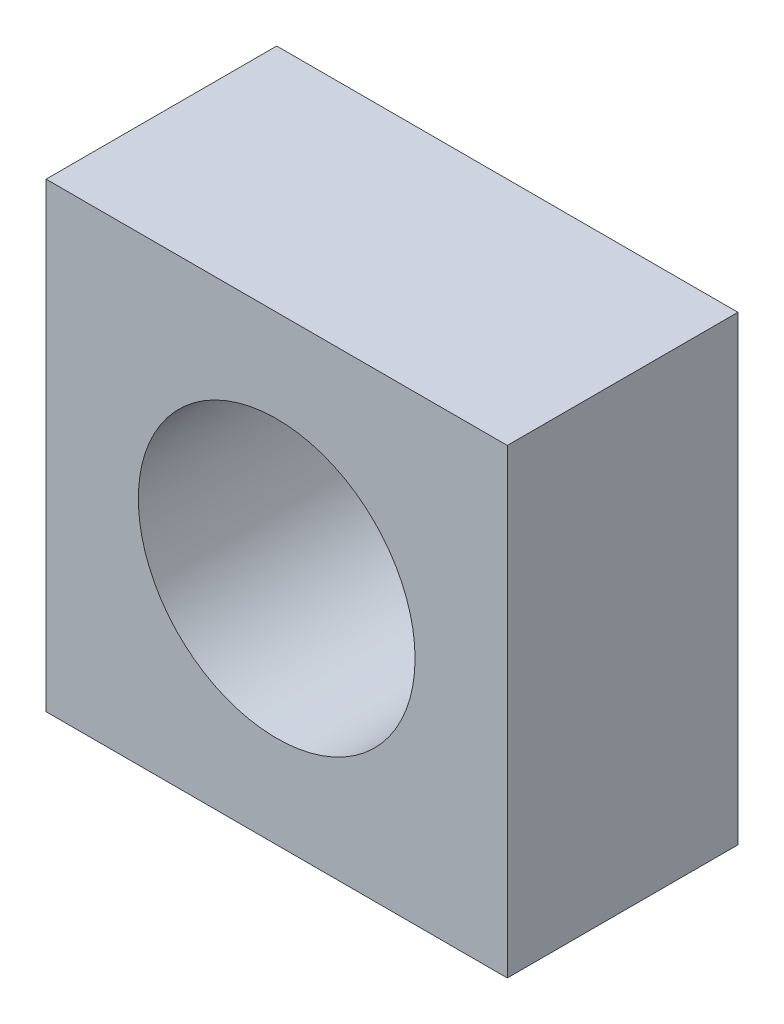
ISO-10303-21;
HEADER;
FILE_DESCRIPTION(('STEP AP214'),'2;1');
FILE_NAME('part.step','',(''),(''),'','','');
FILE_SCHEMA(('AUTOMOTIVE_DESIGN { 1 0 10303 214 1 1 1 1 }'));
ENDSEC;
DATA;
#1=APPLICATION_CONTEXT('core data for automotive mechanical design processes');
#2=APPLICATION_PROTOCOL_DEFINITION('international standard','automotive_design',2000,#1);
#3=PRODUCT_CONTEXT('',#1,'mechanical');
#4=PRODUCT('Part','Part','',(#3));
#5=PRODUCT_RELATED_PRODUCT_CATEGORY('part','',(#4));
#6=PRODUCT_DEFINITION_FORMATION('','',#4);
#7=PRODUCT_DEFINITION_CONTEXT('part definition',#1,'design');
#8=PRODUCT_DEFINITION('design','',#6,#7);
#9=PRODUCT_DEFINITION_SHAPE('','',#8);
#10=(LENGTH_UNIT() NAMED_UNIT(*) SI_UNIT(.MILLI.,.METRE.));
#11=(NAMED_UNIT(*) PLANE_ANGLE_UNIT() SI_UNIT($,.RADIAN.));
#12=(NAMED_UNIT(*) SI_UNIT($,.STERADIAN.) SOLID_ANGLE_UNIT());
#13=UNCERTAINTY_MEASURE_WITH_UNIT(LENGTH_MEASURE(1.E-05),#10,'distance_accuracy_value','');
#14=(GEOMETRIC_REPRESENTATION_CONTEXT(3) GLOBAL_UNCERTAINTY_ASSIGNED_CONTEXT((#13)) GLOBAL_UNIT_ASSIGNED_CONTEXT((#10,
#11,#12)) REPRESENTATION_CONTEXT('',''));
#15=CARTESIAN_POINT('',(0.,0.,0.));
#16=DIRECTION('',(0.,0.,1.));
#17=DIRECTION('',(1.,0.,0.));
#18=AXIS2_PLACEMENT_3D('',#15,#16,#17);
#19=CARTESIAN_POINT('',(0.,0.,2.5));
#20=DIRECTION('',(0.,0.,1.));
#21=DIRECTION('',(1.,0.,0.));
#22=AXIS2_PLACEMENT_3D('',#19,#20,#21);
#23=PLANE('',#22);
#24=DIRECTION('',(0.,-1.,0.));
#25=VECTOR('',#24,1.);
#26=CARTESIAN_POINT('',(-2.5,-2.5,2.5));
#27=LINE('',#26,#25);
#28=CARTESIAN_POINT('',(-2.5,2.5,2.5));
#29=VERTEX_POINT('',#28);
#30=CARTESIAN_POINT('',(-2.5,-2.5,2.5));
#31=VERTEX_POINT('',#30);
#32=EDGE_CURVE('E98',#29,#31,#27,.T.);
#33=ORIENTED_EDGE('',*,*,#32,.T.);
#34=DIRECTION('',(1.,0.,0.));
#35=VECTOR('',#34,1.);
#36=CARTESIAN_POINT('',(2.5,-2.5,2.5));
#37=LINE('',#36,#35);
#38=CARTESIAN_POINT('',(2.5,-2.5,2.5));
#39=VERTEX_POINT('',#38);
#40=EDGE_CURVE('E93',#31,#39,#37,.T.);
#41=ORIENTED_EDGE('',*,*,#40,.T.);
#42=DIRECTION('',(0.,1.,0.));
#43=VECTOR('',#42,1.);
#44=CARTESIAN_POINT('',(2.5,-2.5,2.5));
#45=LINE('',#44,#43);
#46=CARTESIAN_POINT('',(2.5,2.5,2.5));
#47=VERTEX_POINT('',#46);
#48=EDGE_CURVE('E96',#39,#47,#45,.T.);
#49=ORIENTED_EDGE('',*,*,#48,.T.);
#50=DIRECTION('',(-1.,0.,0.));
#51=VECTOR('',#50,1.);
#52=CARTESIAN_POINT('',(2.5,2.5,2.5));
#53=LINE('',#52,#51);
#54=EDGE_CURVE('E63',#47,#29,#53,.T.);
#55=ORIENTED_EDGE('',*,*,#54,.T.);
#56=EDGE_LOOP('',(#33,#41,#49,#55));
#57=FACE_BOUND('',#56,.T.);
#58=CARTESIAN_POINT('',(0.,0.,2.5));
#59=DIRECTION('',(0.,0.,1.));
#60=DIRECTION('',(1.,0.,0.));
#61=AXIS2_PLACEMENT_3D('',#58,#59,#60);
#62=CIRCLE('',#61,1.5);
#63=CARTESIAN_POINT('',(1.5,0.,2.5));
#64=VERTEX_POINT('',#63);
#65=EDGE_CURVE('E118',#64,#64,#62,.T.);
#66=ORIENTED_EDGE('',*,*,#65,.F.);
#67=EDGE_LOOP('',(#66));
#68=FACE_BOUND('',#67,.T.);
#69=ADVANCED_FACE('F45',(#57,#68),#23,.T.);
#70=CARTESIAN_POINT('',(0.,0.,0.));
#71=DIRECTION('',(0.,0.,1.));
#72=DIRECTION('',(1.,0.,0.));
#73=AXIS2_PLACEMENT_3D('',#70,#71,#72);
#74=PLANE('',#73);
#75=DIRECTION('',(0.,-1.,0.));
#76=VECTOR('',#75,1.);
#77=CARTESIAN_POINT('',(-2.5,-2.5,0.));
#78=LINE('',#77,#76);
#79=CARTESIAN_POINT('',(-2.5,2.5,0.));
#80=VERTEX_POINT('',#79);
#81=CARTESIAN_POINT('',(-2.5,-2.5,0.));
#82=VERTEX_POINT('',#81);
#83=EDGE_CURVE('E114',#80,#82,#78,.T.);
#84=ORIENTED_EDGE('',*,*,#83,.F.);
#85=DIRECTION('',(-1.,0.,0.));
#86=VECTOR('',#85,1.);
#87=CARTESIAN_POINT('',(2.5,2.5,0.));
#88=LINE('',#87,#86);
#89=CARTESIAN_POINT('',(2.5,2.5,0.));
#90=VERTEX_POINT('',#89);
#91=EDGE_CURVE('E86',#90,#80,#88,.T.);
#92=ORIENTED_EDGE('',*,*,#91,.F.);
#93=DIRECTION('',(0.,1.,0.));
#94=VECTOR('',#93,1.);
#95=CARTESIAN_POINT('',(2.5,-2.5,0.));
#96=LINE('',#95,#94);
#97=CARTESIAN_POINT('',(2.5,-2.5,0.));
#98=VERTEX_POINT('',#97);
#99=EDGE_CURVE('E80',#98,#90,#96,.T.);
#100=ORIENTED_EDGE('',*,*,#99,.F.);
#101=DIRECTION('',(1.,0.,0.));
#102=VECTOR('',#101,1.);
#103=CARTESIAN_POINT('',(2.5,-2.5,0.));
#104=LINE('',#103,#102);
#105=EDGE_CURVE('E103',#82,#98,#104,.T.);
#106=ORIENTED_EDGE('',*,*,#105,.F.);
#107=EDGE_LOOP('',(#84,#92,#100,#106));
#108=FACE_BOUND('',#107,.T.);
#109=CARTESIAN_POINT('',(0.,0.,0.));
#110=DIRECTION('',(0.,0.,1.));
#111=DIRECTION('',(1.,0.,0.));
#112=AXIS2_PLACEMENT_3D('',#109,#110,#111);
#113=CIRCLE('',#112,1.5);
#114=CARTESIAN_POINT('',(1.5,0.,0.));
#115=VERTEX_POINT('',#114);
#116=EDGE_CURVE('E136',#115,#115,#113,.T.);
#117=ORIENTED_EDGE('',*,*,#116,.T.);
#118=EDGE_LOOP('',(#117));
#119=FACE_BOUND('',#118,.T.);
#120=ADVANCED_FACE('F131',(#108,#119),#74,.F.);
#121=CARTESIAN_POINT('',(-2.5,-2.5,2.5));
#122=DIRECTION('',(1.,0.,0.));
#123=DIRECTION('',(0.,0.,-1.));
#124=AXIS2_PLACEMENT_3D('',#121,#122,#123);
#125=PLANE('',#124);
#126=ORIENTED_EDGE('',*,*,#83,.T.);
#127=DIRECTION('',(0.,0.,-1.));
#128=VECTOR('',#127,1.);
#129=CARTESIAN_POINT('',(-2.5,-2.5,2.5));
#130=LINE('',#129,#128);
#131=EDGE_CURVE('E11',#31,#82,#130,.T.);
#132=ORIENTED_EDGE('',*,*,#131,.F.);
#133=ORIENTED_EDGE('',*,*,#32,.F.);
#134=DIRECTION('',(0.,0.,-1.));
#135=VECTOR('',#134,1.);
#136=CARTESIAN_POINT('',(-2.5,2.5,2.5));
#137=LINE('',#136,#135);
#138=EDGE_CURVE('E110',#29,#80,#137,.T.);
#139=ORIENTED_EDGE('',*,*,#138,.T.);
#140=EDGE_LOOP('',(#126,#132,#133,#139));
#141=FACE_BOUND('',#140,.T.);
#142=ADVANCED_FACE('F47',(#141),#125,.F.);
#143=CARTESIAN_POINT('',(2.5,-2.5,2.5));
#144=DIRECTION('',(0.,1.,0.));
#145=DIRECTION('',(-1.,0.,0.));
#146=AXIS2_PLACEMENT_3D('',#143,#144,#145);
#147=PLANE('',#146);
#148=ORIENTED_EDGE('',*,*,#105,.T.);
#149=DIRECTION('',(0.,0.,-1.));
#150=VECTOR('',#149,1.);
#151=CARTESIAN_POINT('',(2.5,-2.5,2.5));
#152=LINE('',#151,#150);
#153=EDGE_CURVE('E55',#39,#98,#152,.T.);
#154=ORIENTED_EDGE('',*,*,#153,.F.);
#155=ORIENTED_EDGE('',*,*,#40,.F.);
#156=ORIENTED_EDGE('',*,*,#131,.T.);
#157=EDGE_LOOP('',(#148,#154,#155,#156));
#158=FACE_BOUND('',#157,.T.);
#159=ADVANCED_FACE('F102',(#158),#147,.F.);
#160=CARTESIAN_POINT('',(2.5,-2.5,2.5));
#161=DIRECTION('',(-1.,0.,0.));
#162=DIRECTION('',(0.,0.,1.));
#163=AXIS2_PLACEMENT_3D('',#160,#161,#162);
#164=PLANE('',#163);
#165=ORIENTED_EDGE('',*,*,#99,.T.);
#166=DIRECTION('',(0.,0.,-1.));
#167=VECTOR('',#166,1.);
#168=CARTESIAN_POINT('',(2.5,2.5,2.5));
#169=LINE('',#168,#167);
#170=EDGE_CURVE('E105',#47,#90,#169,.T.);
#171=ORIENTED_EDGE('',*,*,#170,.F.);
#172=ORIENTED_EDGE('',*,*,#48,.F.);
#173=ORIENTED_EDGE('',*,*,#153,.T.);
#174=EDGE_LOOP('',(#165,#171,#172,#173));
#175=FACE_BOUND('',#174,.T.);
#176=ADVANCED_FACE('F106',(#175),#164,.F.);
#177=CARTESIAN_POINT('',(2.5,2.5,2.5));
#178=DIRECTION('',(0.,-1.,0.));
#179=DIRECTION('',(1.,0.,0.));
#180=AXIS2_PLACEMENT_3D('',#177,#178,#179);
#181=PLANE('',#180);
#182=ORIENTED_EDGE('',*,*,#91,.T.);
#183=ORIENTED_EDGE('',*,*,#138,.F.);
#184=ORIENTED_EDGE('',*,*,#54,.F.);
#185=ORIENTED_EDGE('',*,*,#170,.T.);
#186=EDGE_LOOP('',(#182,#183,#184,#185));
#187=FACE_BOUND('',#186,.T.);
#188=ADVANCED_FACE('F128',(#187),#181,.F.);
#189=CARTESIAN_POINT('',(0.,0.,2.5));
#190=DIRECTION('',(0.,0.,-1.));
#191=DIRECTION('',(-1.,0.,0.));
#192=AXIS2_PLACEMENT_3D('',#189,#190,#191);
#193=CYLINDRICAL_SURFACE('',#192,1.5);
#194=ORIENTED_EDGE('',*,*,#65,.T.);
#195=EDGE_LOOP('',(#194));
#196=FACE_BOUND('',#195,.T.);
#197=ORIENTED_EDGE('',*,*,#116,.F.);
#198=EDGE_LOOP('',(#197));
#199=FACE_BOUND('',#198,.T.);
#200=ADVANCED_FACE('F144',(#196,#199),#193,.F.);
#201=CLOSED_SHELL('',(#69,#120,#142,#159,#176,#188,#200));
#202=MANIFOLD_SOLID_BREP('B2',#201);
#203=ADVANCED_BREP_SHAPE_REPRESENTATION('',(#18,#202),#14);
#204=SHAPE_DEFINITION_REPRESENTATION(#9,#203);
ENDSEC;
END-ISO-10303-21;
